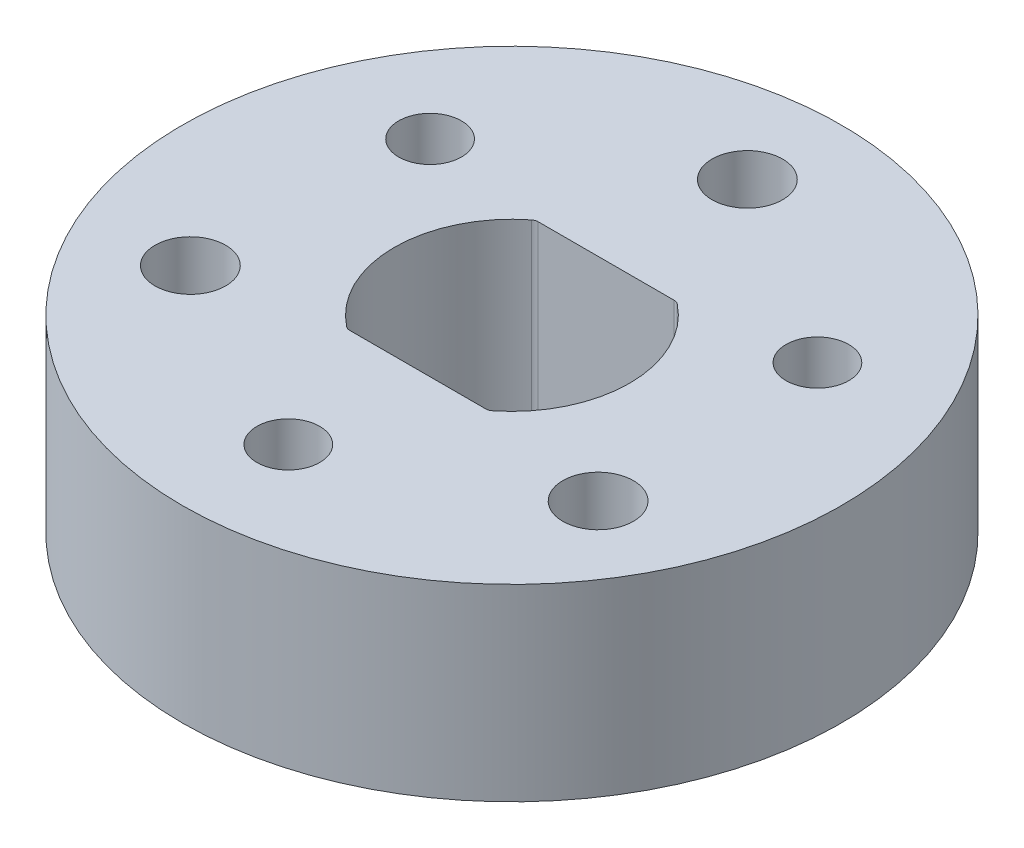
ISO-10303-21;
HEADER;
FILE_DESCRIPTION(('STEP AP214'),'2;1');
FILE_NAME('part.step','',(''),(''),'','','');
FILE_SCHEMA(('AUTOMOTIVE_DESIGN { 1 0 10303 214 1 1 1 1 }'));
ENDSEC;
DATA;
#1=APPLICATION_CONTEXT('core data for automotive mechanical design processes');
#2=APPLICATION_PROTOCOL_DEFINITION('international standard','automotive_design',2000,#1);
#3=PRODUCT_CONTEXT('',#1,'mechanical');
#4=PRODUCT('Part','Part','',(#3));
#5=PRODUCT_RELATED_PRODUCT_CATEGORY('part','',(#4));
#6=PRODUCT_DEFINITION_FORMATION('','',#4);
#7=PRODUCT_DEFINITION_CONTEXT('part definition',#1,'design');
#8=PRODUCT_DEFINITION('design','',#6,#7);
#9=PRODUCT_DEFINITION_SHAPE('','',#8);
#10=(LENGTH_UNIT() NAMED_UNIT(*) SI_UNIT(.MILLI.,.METRE.));
#11=(NAMED_UNIT(*) PLANE_ANGLE_UNIT() SI_UNIT($,.RADIAN.));
#12=(NAMED_UNIT(*) SI_UNIT($,.STERADIAN.) SOLID_ANGLE_UNIT());
#13=UNCERTAINTY_MEASURE_WITH_UNIT(LENGTH_MEASURE(1.E-05),#10,'distance_accuracy_value','');
#14=(GEOMETRIC_REPRESENTATION_CONTEXT(3) GLOBAL_UNCERTAINTY_ASSIGNED_CONTEXT((#13)) GLOBAL_UNIT_ASSIGNED_CONTEXT((#10,
#11,#12)) REPRESENTATION_CONTEXT('',''));
#15=CARTESIAN_POINT('',(0.,0.,0.));
#16=DIRECTION('',(0.,0.,1.));
#17=DIRECTION('',(1.,0.,0.));
#18=AXIS2_PLACEMENT_3D('',#15,#16,#17);
#19=CARTESIAN_POINT('',(0.,12.,0.));
#20=DIRECTION('',(0.,1.,0.));
#21=DIRECTION('',(0.,0.,1.));
#22=AXIS2_PLACEMENT_3D('',#19,#20,#21);
#23=PLANE('',#22);
#24=CARTESIAN_POINT('',(-12.3408620039283,12.,-7.12499999999997));
#25=DIRECTION('',(0.,1.,0.));
#26=DIRECTION('',(0.,0.,1.));
#27=AXIS2_PLACEMENT_3D('',#24,#25,#26);
#28=CIRCLE('',#27,2.);
#29=CARTESIAN_POINT('',(-12.3408620039283,12.,-5.12499999999997));
#30=VERTEX_POINT('',#29);
#31=EDGE_CURVE('E280',#30,#30,#28,.T.);
#32=ORIENTED_EDGE('',*,*,#31,.F.);
#33=EDGE_LOOP('',(#32));
#34=FACE_BOUND('',#33,.T.);
#35=CARTESIAN_POINT('',(12.3408620039282,12.,-7.12500000000108));
#36=DIRECTION('',(0.,1.,0.));
#37=DIRECTION('',(0.,0.,1.));
#38=AXIS2_PLACEMENT_3D('',#35,#36,#37);
#39=CIRCLE('',#38,2.);
#40=CARTESIAN_POINT('',(12.3408620039282,12.,-5.12500000000108));
#41=VERTEX_POINT('',#40);
#42=EDGE_CURVE('E272',#41,#41,#39,.T.);
#43=ORIENTED_EDGE('',*,*,#42,.F.);
#44=EDGE_LOOP('',(#43));
#45=FACE_BOUND('',#44,.T.);
#46=CARTESIAN_POINT('',(9.38288439063618E-13,12.,14.2499999999995));
#47=DIRECTION('',(0.,1.,0.));
#48=DIRECTION('',(0.,0.,1.));
#49=AXIS2_PLACEMENT_3D('',#46,#47,#48);
#50=CIRCLE('',#49,2.);
#51=CARTESIAN_POINT('',(9.38288439063618E-13,12.,16.2499999999995));
#52=VERTEX_POINT('',#51);
#53=EDGE_CURVE('E264',#52,#52,#50,.T.);
#54=ORIENTED_EDGE('',*,*,#53,.F.);
#55=EDGE_LOOP('',(#54));
#56=FACE_BOUND('',#55,.T.);
#57=CARTESIAN_POINT('',(0.,12.,-15.));
#58=DIRECTION('',(0.,1.,0.));
#59=DIRECTION('',(0.,0.,1.));
#60=AXIS2_PLACEMENT_3D('',#57,#58,#59);
#61=CIRCLE('',#60,2.24999999999999);
#62=CARTESIAN_POINT('',(0.,12.,-12.75));
#63=VERTEX_POINT('',#62);
#64=EDGE_CURVE('E256',#63,#63,#61,.T.);
#65=ORIENTED_EDGE('',*,*,#64,.F.);
#66=EDGE_LOOP('',(#65));
#67=FACE_BOUND('',#66,.T.);
#68=CARTESIAN_POINT('',(12.9903810567675,12.,7.49999999999945));
#69=DIRECTION('',(0.,1.,0.));
#70=DIRECTION('',(0.,0.,1.));
#71=AXIS2_PLACEMENT_3D('',#68,#69,#70);
#72=CIRCLE('',#71,2.24999999999999);
#73=CARTESIAN_POINT('',(12.9903810567675,12.,9.74999999999944));
#74=VERTEX_POINT('',#73);
#75=EDGE_CURVE('E248',#74,#74,#72,.T.);
#76=ORIENTED_EDGE('',*,*,#75,.F.);
#77=EDGE_LOOP('',(#76));
#78=FACE_BOUND('',#77,.T.);
#79=CARTESIAN_POINT('',(-12.9903810567656,12.,7.50000000000055));
#80=DIRECTION('',(0.,1.,0.));
#81=DIRECTION('',(0.,0.,1.));
#82=AXIS2_PLACEMENT_3D('',#79,#80,#81);
#83=CIRCLE('',#82,2.24999999999999);
#84=CARTESIAN_POINT('',(-12.9903810567656,12.,9.75000000000054));
#85=VERTEX_POINT('',#84);
#86=EDGE_CURVE('E240',#85,#85,#83,.T.);
#87=ORIENTED_EDGE('',*,*,#86,.F.);
#88=EDGE_LOOP('',(#87));
#89=FACE_BOUND('',#88,.T.);
#90=CARTESIAN_POINT('',(0.,12.,0.));
#91=DIRECTION('',(0.,1.,0.));
#92=DIRECTION('',(0.,0.,1.));
#93=AXIS2_PLACEMENT_3D('',#90,#91,#92);
#94=CIRCLE('',#93,7.50000000000001);
#95=CARTESIAN_POINT('',(4.63942180598808,12.,5.89285714285714));
#96=VERTEX_POINT('',#95);
#97=CARTESIAN_POINT('',(4.63942180598808,12.,-5.89285714285714));
#98=VERTEX_POINT('',#97);
#99=EDGE_CURVE('E142',#96,#98,#94,.T.);
#100=ORIENTED_EDGE('',*,*,#99,.F.);
#101=CARTESIAN_POINT('',(4.33012701892221,12.,5.5));
#102=DIRECTION('',(0.,1.,0.));
#103=DIRECTION('',(0.,0.,1.));
#104=AXIS2_PLACEMENT_3D('',#101,#102,#103);
#105=CIRCLE('',#104,0.5);
#106=CARTESIAN_POINT('',(4.33012701892221,12.,6.));
#107=VERTEX_POINT('',#106);
#108=EDGE_CURVE('E125',#96,#107,#105,.F.);
#109=ORIENTED_EDGE('',*,*,#108,.T.);
#110=DIRECTION('',(1.,0.,0.));
#111=VECTOR('',#110,1.);
#112=CARTESIAN_POINT('',(-4.50000000000002,12.,6.));
#113=LINE('',#112,#111);
#114=CARTESIAN_POINT('',(-4.33012701892221,12.,6.));
#115=VERTEX_POINT('',#114);
#116=EDGE_CURVE('E153',#115,#107,#113,.T.);
#117=ORIENTED_EDGE('',*,*,#116,.F.);
#118=CARTESIAN_POINT('',(-4.33012701892221,12.,5.5));
#119=DIRECTION('',(0.,1.,0.));
#120=DIRECTION('',(0.,0.,1.));
#121=AXIS2_PLACEMENT_3D('',#118,#119,#120);
#122=CIRCLE('',#121,0.5);
#123=CARTESIAN_POINT('',(-4.63942180598808,12.,5.89285714285714));
#124=VERTEX_POINT('',#123);
#125=EDGE_CURVE('E186',#115,#124,#122,.F.);
#126=ORIENTED_EDGE('',*,*,#125,.T.);
#127=CARTESIAN_POINT('',(0.,12.,0.));
#128=DIRECTION('',(0.,1.,0.));
#129=DIRECTION('',(0.,0.,1.));
#130=AXIS2_PLACEMENT_3D('',#127,#128,#129);
#131=CIRCLE('',#130,7.50000000000001);
#132=CARTESIAN_POINT('',(-4.63942180598808,12.,-5.89285714285714));
#133=VERTEX_POINT('',#132);
#134=EDGE_CURVE('E160',#133,#124,#131,.T.);
#135=ORIENTED_EDGE('',*,*,#134,.F.);
#136=CARTESIAN_POINT('',(-4.33012701892221,12.,-5.5));
#137=DIRECTION('',(0.,1.,0.));
#138=DIRECTION('',(0.,0.,1.));
#139=AXIS2_PLACEMENT_3D('',#136,#137,#138);
#140=CIRCLE('',#139,0.5);
#141=CARTESIAN_POINT('',(-4.33012701892221,12.,-6.));
#142=VERTEX_POINT('',#141);
#143=EDGE_CURVE('E192',#133,#142,#140,.F.);
#144=ORIENTED_EDGE('',*,*,#143,.T.);
#145=DIRECTION('',(-1.,0.,0.));
#146=VECTOR('',#145,1.);
#147=CARTESIAN_POINT('',(-4.50000000000002,12.,-6.));
#148=LINE('',#147,#146);
#149=CARTESIAN_POINT('',(4.33012701892221,12.,-6.));
#150=VERTEX_POINT('',#149);
#151=EDGE_CURVE('E206',#150,#142,#148,.T.);
#152=ORIENTED_EDGE('',*,*,#151,.F.);
#153=CARTESIAN_POINT('',(4.33012701892221,12.,-5.5));
#154=DIRECTION('',(0.,1.,0.));
#155=DIRECTION('',(0.,0.,1.));
#156=AXIS2_PLACEMENT_3D('',#153,#154,#155);
#157=CIRCLE('',#156,0.5);
#158=EDGE_CURVE('E68',#150,#98,#157,.F.);
#159=ORIENTED_EDGE('',*,*,#158,.T.);
#160=EDGE_LOOP('',(#100,#109,#117,#126,#135,#144,#152,#159));
#161=FACE_BOUND('',#160,.T.);
#162=CARTESIAN_POINT('',(0.,12.,0.));
#163=DIRECTION('',(0.,1.,0.));
#164=DIRECTION('',(0.,0.,1.));
#165=AXIS2_PLACEMENT_3D('',#162,#163,#164);
#166=CIRCLE('',#165,21.);
#167=CARTESIAN_POINT('',(0.,12.,21.));
#168=VERTEX_POINT('',#167);
#169=EDGE_CURVE('E158',#168,#168,#166,.T.);
#170=ORIENTED_EDGE('',*,*,#169,.T.);
#171=EDGE_LOOP('',(#170));
#172=FACE_BOUND('',#171,.T.);
#173=ADVANCED_FACE('F59',(#34,#45,#56,#67,#78,#89,#161,#172),#23,.T.);
#174=CARTESIAN_POINT('',(0.,0.,0.));
#175=DIRECTION('',(0.,1.,0.));
#176=DIRECTION('',(0.,0.,1.));
#177=AXIS2_PLACEMENT_3D('',#174,#175,#176);
#178=PLANE('',#177);
#179=CARTESIAN_POINT('',(-12.3408620039283,0.,-7.12499999999997));
#180=DIRECTION('',(0.,1.,0.));
#181=DIRECTION('',(0.,0.,1.));
#182=AXIS2_PLACEMENT_3D('',#179,#180,#181);
#183=CIRCLE('',#182,2.);
#184=CARTESIAN_POINT('',(-12.3408620039283,0.,-5.12499999999997));
#185=VERTEX_POINT('',#184);
#186=EDGE_CURVE('E276',#185,#185,#183,.T.);
#187=ORIENTED_EDGE('',*,*,#186,.T.);
#188=EDGE_LOOP('',(#187));
#189=FACE_BOUND('',#188,.T.);
#190=CARTESIAN_POINT('',(12.3408620039282,0.,-7.12500000000108));
#191=DIRECTION('',(0.,1.,0.));
#192=DIRECTION('',(0.,0.,1.));
#193=AXIS2_PLACEMENT_3D('',#190,#191,#192);
#194=CIRCLE('',#193,2.);
#195=CARTESIAN_POINT('',(12.3408620039282,0.,-5.12500000000108));
#196=VERTEX_POINT('',#195);
#197=EDGE_CURVE('E268',#196,#196,#194,.T.);
#198=ORIENTED_EDGE('',*,*,#197,.T.);
#199=EDGE_LOOP('',(#198));
#200=FACE_BOUND('',#199,.T.);
#201=CARTESIAN_POINT('',(9.38288439063618E-13,0.,14.2499999999995));
#202=DIRECTION('',(0.,1.,0.));
#203=DIRECTION('',(0.,0.,1.));
#204=AXIS2_PLACEMENT_3D('',#201,#202,#203);
#205=CIRCLE('',#204,2.);
#206=CARTESIAN_POINT('',(9.38288439063618E-13,0.,16.2499999999995));
#207=VERTEX_POINT('',#206);
#208=EDGE_CURVE('E260',#207,#207,#205,.T.);
#209=ORIENTED_EDGE('',*,*,#208,.T.);
#210=EDGE_LOOP('',(#209));
#211=FACE_BOUND('',#210,.T.);
#212=CARTESIAN_POINT('',(0.,0.,-15.));
#213=DIRECTION('',(0.,1.,0.));
#214=DIRECTION('',(0.,0.,1.));
#215=AXIS2_PLACEMENT_3D('',#212,#213,#214);
#216=CIRCLE('',#215,2.25);
#217=CARTESIAN_POINT('',(0.,0.,-12.75));
#218=VERTEX_POINT('',#217);
#219=EDGE_CURVE('E252',#218,#218,#216,.T.);
#220=ORIENTED_EDGE('',*,*,#219,.T.);
#221=EDGE_LOOP('',(#220));
#222=FACE_BOUND('',#221,.T.);
#223=CARTESIAN_POINT('',(12.9903810567675,0.,7.49999999999945));
#224=DIRECTION('',(0.,1.,0.));
#225=DIRECTION('',(0.,0.,1.));
#226=AXIS2_PLACEMENT_3D('',#223,#224,#225);
#227=CIRCLE('',#226,2.25);
#228=CARTESIAN_POINT('',(12.9903810567675,0.,9.74999999999944));
#229=VERTEX_POINT('',#228);
#230=EDGE_CURVE('E244',#229,#229,#227,.T.);
#231=ORIENTED_EDGE('',*,*,#230,.T.);
#232=EDGE_LOOP('',(#231));
#233=FACE_BOUND('',#232,.T.);
#234=CARTESIAN_POINT('',(-12.9903810567656,0.,7.50000000000055));
#235=DIRECTION('',(0.,1.,0.));
#236=DIRECTION('',(0.,0.,1.));
#237=AXIS2_PLACEMENT_3D('',#234,#235,#236);
#238=CIRCLE('',#237,2.25);
#239=CARTESIAN_POINT('',(-12.9903810567656,0.,9.75000000000055));
#240=VERTEX_POINT('',#239);
#241=EDGE_CURVE('E236',#240,#240,#238,.T.);
#242=ORIENTED_EDGE('',*,*,#241,.T.);
#243=EDGE_LOOP('',(#242));
#244=FACE_BOUND('',#243,.T.);
#245=CARTESIAN_POINT('',(0.,0.,0.));
#246=DIRECTION('',(0.,1.,0.));
#247=DIRECTION('',(0.,0.,1.));
#248=AXIS2_PLACEMENT_3D('',#245,#246,#247);
#249=CIRCLE('',#248,7.50000000000001);
#250=CARTESIAN_POINT('',(-4.63942180598808,0.,-5.89285714285714));
#251=VERTEX_POINT('',#250);
#252=CARTESIAN_POINT('',(-4.63942180598808,0.,5.89285714285714));
#253=VERTEX_POINT('',#252);
#254=EDGE_CURVE('E225',#251,#253,#249,.T.);
#255=ORIENTED_EDGE('',*,*,#254,.T.);
#256=CARTESIAN_POINT('',(-4.33012701892221,0.,5.5));
#257=DIRECTION('',(0.,1.,0.));
#258=DIRECTION('',(0.,0.,1.));
#259=AXIS2_PLACEMENT_3D('',#256,#257,#258);
#260=CIRCLE('',#259,0.5);
#261=CARTESIAN_POINT('',(-4.33012701892221,0.,6.));
#262=VERTEX_POINT('',#261);
#263=EDGE_CURVE('E189',#253,#262,#260,.T.);
#264=ORIENTED_EDGE('',*,*,#263,.T.);
#265=DIRECTION('',(1.,0.,0.));
#266=VECTOR('',#265,1.);
#267=CARTESIAN_POINT('',(-4.50000000000002,0.,6.));
#268=LINE('',#267,#266);
#269=CARTESIAN_POINT('',(4.33012701892221,0.,6.));
#270=VERTEX_POINT('',#269);
#271=EDGE_CURVE('E203',#262,#270,#268,.T.);
#272=ORIENTED_EDGE('',*,*,#271,.T.);
#273=CARTESIAN_POINT('',(4.33012701892221,0.,5.5));
#274=DIRECTION('',(0.,1.,0.));
#275=DIRECTION('',(0.,0.,1.));
#276=AXIS2_PLACEMENT_3D('',#273,#274,#275);
#277=CIRCLE('',#276,0.5);
#278=CARTESIAN_POINT('',(4.63942180598808,0.,5.89285714285714));
#279=VERTEX_POINT('',#278);
#280=EDGE_CURVE('E136',#270,#279,#277,.T.);
#281=ORIENTED_EDGE('',*,*,#280,.T.);
#282=CARTESIAN_POINT('',(0.,0.,0.));
#283=DIRECTION('',(0.,1.,0.));
#284=DIRECTION('',(0.,0.,1.));
#285=AXIS2_PLACEMENT_3D('',#282,#283,#284);
#286=CIRCLE('',#285,7.50000000000001);
#287=CARTESIAN_POINT('',(4.63942180598808,0.,-5.89285714285714));
#288=VERTEX_POINT('',#287);
#289=EDGE_CURVE('E144',#279,#288,#286,.T.);
#290=ORIENTED_EDGE('',*,*,#289,.T.);
#291=CARTESIAN_POINT('',(4.33012701892221,0.,-5.5));
#292=DIRECTION('',(0.,1.,0.));
#293=DIRECTION('',(0.,0.,1.));
#294=AXIS2_PLACEMENT_3D('',#291,#292,#293);
#295=CIRCLE('',#294,0.5);
#296=CARTESIAN_POINT('',(4.33012701892221,0.,-6.));
#297=VERTEX_POINT('',#296);
#298=EDGE_CURVE('E13',#288,#297,#295,.T.);
#299=ORIENTED_EDGE('',*,*,#298,.T.);
#300=DIRECTION('',(-1.,0.,0.));
#301=VECTOR('',#300,1.);
#302=CARTESIAN_POINT('',(-4.50000000000002,0.,-6.));
#303=LINE('',#302,#301);
#304=CARTESIAN_POINT('',(-4.33012701892221,0.,-6.));
#305=VERTEX_POINT('',#304);
#306=EDGE_CURVE('E230',#297,#305,#303,.T.);
#307=ORIENTED_EDGE('',*,*,#306,.T.);
#308=CARTESIAN_POINT('',(-4.33012701892221,0.,-5.5));
#309=DIRECTION('',(0.,1.,0.));
#310=DIRECTION('',(0.,0.,1.));
#311=AXIS2_PLACEMENT_3D('',#308,#309,#310);
#312=CIRCLE('',#311,0.5);
#313=EDGE_CURVE('E195',#305,#251,#312,.T.);
#314=ORIENTED_EDGE('',*,*,#313,.T.);
#315=EDGE_LOOP('',(#255,#264,#272,#281,#290,#299,#307,#314));
#316=FACE_BOUND('',#315,.T.);
#317=CARTESIAN_POINT('',(0.,0.,0.));
#318=DIRECTION('',(0.,1.,0.));
#319=DIRECTION('',(0.,0.,1.));
#320=AXIS2_PLACEMENT_3D('',#317,#318,#319);
#321=CIRCLE('',#320,21.);
#322=CARTESIAN_POINT('',(0.,0.,21.));
#323=VERTEX_POINT('',#322);
#324=EDGE_CURVE('E152',#323,#323,#321,.T.);
#325=ORIENTED_EDGE('',*,*,#324,.F.);
#326=EDGE_LOOP('',(#325));
#327=FACE_BOUND('',#326,.T.);
#328=ADVANCED_FACE('F223',(#189,#200,#211,#222,#233,#244,#316,#327),#178,.F.);
#329=CARTESIAN_POINT('',(0.,12.,0.));
#330=DIRECTION('',(0.,-1.,0.));
#331=DIRECTION('',(0.,0.,-1.));
#332=AXIS2_PLACEMENT_3D('',#329,#330,#331);
#333=CYLINDRICAL_SURFACE('',#332,21.);
#334=ORIENTED_EDGE('',*,*,#169,.F.);
#335=EDGE_LOOP('',(#334));
#336=FACE_BOUND('',#335,.T.);
#337=ORIENTED_EDGE('',*,*,#324,.T.);
#338=EDGE_LOOP('',(#337));
#339=FACE_BOUND('',#338,.T.);
#340=ADVANCED_FACE('F325',(#336,#339),#333,.T.);
#341=CARTESIAN_POINT('',(0.,0.,0.));
#342=DIRECTION('',(0.,1.,0.));
#343=DIRECTION('',(0.,0.,1.));
#344=AXIS2_PLACEMENT_3D('',#341,#342,#343);
#345=CYLINDRICAL_SURFACE('',#344,7.50000000000001);
#346=ORIENTED_EDGE('',*,*,#289,.F.);
#347=DIRECTION('',(0.,1.,0.));
#348=VECTOR('',#347,1.);
#349=CARTESIAN_POINT('',(4.63942180598808,0.,5.89285714285714));
#350=LINE('',#349,#348);
#351=EDGE_CURVE('E129',#279,#96,#350,.T.);
#352=ORIENTED_EDGE('',*,*,#351,.T.);
#353=ORIENTED_EDGE('',*,*,#99,.T.);
#354=DIRECTION('',(0.,1.,0.));
#355=VECTOR('',#354,1.);
#356=CARTESIAN_POINT('',(4.63942180598808,0.,-5.89285714285714));
#357=LINE('',#356,#355);
#358=EDGE_CURVE('E147',#98,#288,#357,.F.);
#359=ORIENTED_EDGE('',*,*,#358,.T.);
#360=EDGE_LOOP('',(#346,#352,#353,#359));
#361=FACE_BOUND('',#360,.T.);
#362=ADVANCED_FACE('F141',(#361),#345,.F.);
#363=CARTESIAN_POINT('',(-4.50000000000002,0.,6.));
#364=DIRECTION('',(0.,0.,1.));
#365=DIRECTION('',(1.,0.,0.));
#366=AXIS2_PLACEMENT_3D('',#363,#364,#365);
#367=PLANE('',#366);
#368=ORIENTED_EDGE('',*,*,#116,.T.);
#369=DIRECTION('',(0.,-1.,0.));
#370=VECTOR('',#369,1.);
#371=CARTESIAN_POINT('',(4.33012701892221,0.,6.));
#372=LINE('',#371,#370);
#373=EDGE_CURVE('E130',#107,#270,#372,.T.);
#374=ORIENTED_EDGE('',*,*,#373,.T.);
#375=ORIENTED_EDGE('',*,*,#271,.F.);
#376=DIRECTION('',(0.,-1.,0.));
#377=VECTOR('',#376,1.);
#378=CARTESIAN_POINT('',(-4.33012701892221,12.,6.));
#379=LINE('',#378,#377);
#380=EDGE_CURVE('E146',#262,#115,#379,.F.);
#381=ORIENTED_EDGE('',*,*,#380,.T.);
#382=EDGE_LOOP('',(#368,#374,#375,#381));
#383=FACE_BOUND('',#382,.T.);
#384=ADVANCED_FACE('F227',(#383),#367,.F.);
#385=CARTESIAN_POINT('',(0.,0.,0.));
#386=DIRECTION('',(0.,1.,0.));
#387=DIRECTION('',(0.,0.,1.));
#388=AXIS2_PLACEMENT_3D('',#385,#386,#387);
#389=CYLINDRICAL_SURFACE('',#388,7.50000000000001);
#390=ORIENTED_EDGE('',*,*,#134,.T.);
#391=DIRECTION('',(0.,1.,0.));
#392=VECTOR('',#391,1.);
#393=CARTESIAN_POINT('',(-4.63942180598808,0.,5.89285714285714));
#394=LINE('',#393,#392);
#395=EDGE_CURVE('E175',#124,#253,#394,.F.);
#396=ORIENTED_EDGE('',*,*,#395,.T.);
#397=ORIENTED_EDGE('',*,*,#254,.F.);
#398=DIRECTION('',(0.,1.,0.));
#399=VECTOR('',#398,1.);
#400=CARTESIAN_POINT('',(-4.63942180598808,0.,-5.89285714285714));
#401=LINE('',#400,#399);
#402=EDGE_CURVE('E171',#251,#133,#401,.T.);
#403=ORIENTED_EDGE('',*,*,#402,.T.);
#404=EDGE_LOOP('',(#390,#396,#397,#403));
#405=FACE_BOUND('',#404,.T.);
#406=ADVANCED_FACE('F213',(#405),#389,.F.);
#407=CARTESIAN_POINT('',(-4.50000000000002,0.,-6.));
#408=DIRECTION('',(0.,0.,-1.));
#409=DIRECTION('',(-1.,0.,0.));
#410=AXIS2_PLACEMENT_3D('',#407,#408,#409);
#411=PLANE('',#410);
#412=ORIENTED_EDGE('',*,*,#151,.T.);
#413=DIRECTION('',(0.,-1.,0.));
#414=VECTOR('',#413,1.);
#415=CARTESIAN_POINT('',(-4.33012701892221,0.,-6.));
#416=LINE('',#415,#414);
#417=EDGE_CURVE('E75',#142,#305,#416,.T.);
#418=ORIENTED_EDGE('',*,*,#417,.T.);
#419=ORIENTED_EDGE('',*,*,#306,.F.);
#420=DIRECTION('',(0.,-1.,0.));
#421=VECTOR('',#420,1.);
#422=CARTESIAN_POINT('',(4.33012701892221,12.,-6.));
#423=LINE('',#422,#421);
#424=EDGE_CURVE('E178',#297,#150,#423,.F.);
#425=ORIENTED_EDGE('',*,*,#424,.T.);
#426=EDGE_LOOP('',(#412,#418,#419,#425));
#427=FACE_BOUND('',#426,.T.);
#428=ADVANCED_FACE('F321',(#427),#411,.F.);
#429=CARTESIAN_POINT('',(4.33012701892221,0.,5.5));
#430=DIRECTION('',(0.,1.,0.));
#431=DIRECTION('',(0.,0.,1.));
#432=AXIS2_PLACEMENT_3D('',#429,#430,#431);
#433=CYLINDRICAL_SURFACE('',#432,0.5);
#434=ORIENTED_EDGE('',*,*,#280,.F.);
#435=ORIENTED_EDGE('',*,*,#373,.F.);
#436=ORIENTED_EDGE('',*,*,#108,.F.);
#437=ORIENTED_EDGE('',*,*,#351,.F.);
#438=EDGE_LOOP('',(#434,#435,#436,#437));
#439=FACE_BOUND('',#438,.T.);
#440=ADVANCED_FACE('F128',(#439),#433,.F.);
#441=CARTESIAN_POINT('',(-4.33012701892221,0.,5.5));
#442=DIRECTION('',(0.,1.,0.));
#443=DIRECTION('',(0.,0.,1.));
#444=AXIS2_PLACEMENT_3D('',#441,#442,#443);
#445=CYLINDRICAL_SURFACE('',#444,0.5);
#446=ORIENTED_EDGE('',*,*,#263,.F.);
#447=ORIENTED_EDGE('',*,*,#395,.F.);
#448=ORIENTED_EDGE('',*,*,#125,.F.);
#449=ORIENTED_EDGE('',*,*,#380,.F.);
#450=EDGE_LOOP('',(#446,#447,#448,#449));
#451=FACE_BOUND('',#450,.T.);
#452=ADVANCED_FACE('F219',(#451),#445,.F.);
#453=CARTESIAN_POINT('',(-4.33012701892221,0.,-5.5));
#454=DIRECTION('',(0.,1.,0.));
#455=DIRECTION('',(0.,0.,1.));
#456=AXIS2_PLACEMENT_3D('',#453,#454,#455);
#457=CYLINDRICAL_SURFACE('',#456,0.5);
#458=ORIENTED_EDGE('',*,*,#313,.F.);
#459=ORIENTED_EDGE('',*,*,#417,.F.);
#460=ORIENTED_EDGE('',*,*,#143,.F.);
#461=ORIENTED_EDGE('',*,*,#402,.F.);
#462=EDGE_LOOP('',(#458,#459,#460,#461));
#463=FACE_BOUND('',#462,.T.);
#464=ADVANCED_FACE('F312',(#463),#457,.F.);
#465=CARTESIAN_POINT('',(4.33012701892221,0.,-5.5));
#466=DIRECTION('',(0.,1.,0.));
#467=DIRECTION('',(0.,0.,1.));
#468=AXIS2_PLACEMENT_3D('',#465,#466,#467);
#469=CYLINDRICAL_SURFACE('',#468,0.5);
#470=ORIENTED_EDGE('',*,*,#298,.F.);
#471=ORIENTED_EDGE('',*,*,#358,.F.);
#472=ORIENTED_EDGE('',*,*,#158,.F.);
#473=ORIENTED_EDGE('',*,*,#424,.F.);
#474=EDGE_LOOP('',(#470,#471,#472,#473));
#475=FACE_BOUND('',#474,.T.);
#476=ADVANCED_FACE('F61',(#475),#469,.F.);
#477=CARTESIAN_POINT('',(-12.9903810567656,12.,7.50000000000055));
#478=DIRECTION('',(0.,1.,0.));
#479=DIRECTION('',(0.,0.,1.));
#480=AXIS2_PLACEMENT_3D('',#477,#478,#479);
#481=CYLINDRICAL_SURFACE('',#480,2.24999999999999);
#482=ORIENTED_EDGE('',*,*,#241,.F.);
#483=EDGE_LOOP('',(#482));
#484=FACE_BOUND('',#483,.T.);
#485=ORIENTED_EDGE('',*,*,#86,.T.);
#486=EDGE_LOOP('',(#485));
#487=FACE_BOUND('',#486,.T.);
#488=ADVANCED_FACE('F300',(#484,#487),#481,.F.);
#489=CARTESIAN_POINT('',(12.9903810567675,12.,7.49999999999945));
#490=DIRECTION('',(0.,1.,0.));
#491=DIRECTION('',(0.,0.,1.));
#492=AXIS2_PLACEMENT_3D('',#489,#490,#491);
#493=CYLINDRICAL_SURFACE('',#492,2.24999999999999);
#494=ORIENTED_EDGE('',*,*,#230,.F.);
#495=EDGE_LOOP('',(#494));
#496=FACE_BOUND('',#495,.T.);
#497=ORIENTED_EDGE('',*,*,#75,.T.);
#498=EDGE_LOOP('',(#497));
#499=FACE_BOUND('',#498,.T.);
#500=ADVANCED_FACE('F302',(#496,#499),#493,.F.);
#501=CARTESIAN_POINT('',(0.,12.,-15.));
#502=DIRECTION('',(0.,1.,0.));
#503=DIRECTION('',(0.,0.,1.));
#504=AXIS2_PLACEMENT_3D('',#501,#502,#503);
#505=CYLINDRICAL_SURFACE('',#504,2.24999999999999);
#506=ORIENTED_EDGE('',*,*,#219,.F.);
#507=EDGE_LOOP('',(#506));
#508=FACE_BOUND('',#507,.T.);
#509=ORIENTED_EDGE('',*,*,#64,.T.);
#510=EDGE_LOOP('',(#509));
#511=FACE_BOUND('',#510,.T.);
#512=ADVANCED_FACE('F309',(#508,#511),#505,.F.);
#513=CARTESIAN_POINT('',(9.38288439063618E-13,12.,14.2499999999995));
#514=DIRECTION('',(0.,1.,0.));
#515=DIRECTION('',(0.,0.,1.));
#516=AXIS2_PLACEMENT_3D('',#513,#514,#515);
#517=CYLINDRICAL_SURFACE('',#516,2.);
#518=ORIENTED_EDGE('',*,*,#208,.F.);
#519=EDGE_LOOP('',(#518));
#520=FACE_BOUND('',#519,.T.);
#521=ORIENTED_EDGE('',*,*,#53,.T.);
#522=EDGE_LOOP('',(#521));
#523=FACE_BOUND('',#522,.T.);
#524=ADVANCED_FACE('F369',(#520,#523),#517,.F.);
#525=CARTESIAN_POINT('',(12.3408620039282,12.,-7.12500000000108));
#526=DIRECTION('',(0.,1.,0.));
#527=DIRECTION('',(0.,0.,1.));
#528=AXIS2_PLACEMENT_3D('',#525,#526,#527);
#529=CYLINDRICAL_SURFACE('',#528,2.);
#530=ORIENTED_EDGE('',*,*,#197,.F.);
#531=EDGE_LOOP('',(#530));
#532=FACE_BOUND('',#531,.T.);
#533=ORIENTED_EDGE('',*,*,#42,.T.);
#534=EDGE_LOOP('',(#533));
#535=FACE_BOUND('',#534,.T.);
#536=ADVANCED_FACE('F378',(#532,#535),#529,.F.);
#537=CARTESIAN_POINT('',(-12.3408620039283,12.,-7.12499999999997));
#538=DIRECTION('',(0.,1.,0.));
#539=DIRECTION('',(0.,0.,1.));
#540=AXIS2_PLACEMENT_3D('',#537,#538,#539);
#541=CYLINDRICAL_SURFACE('',#540,2.);
#542=ORIENTED_EDGE('',*,*,#186,.F.);
#543=EDGE_LOOP('',(#542));
#544=FACE_BOUND('',#543,.T.);
#545=ORIENTED_EDGE('',*,*,#31,.T.);
#546=EDGE_LOOP('',(#545));
#547=FACE_BOUND('',#546,.T.);
#548=ADVANCED_FACE('F285',(#544,#547),#541,.F.);
#549=CLOSED_SHELL('',(#173,#328,#340,#362,#384,#406,#428,#440,#452,#464,#476,#488,#500,#512,
#524,#536,#548));
#550=MANIFOLD_SOLID_BREP('B2',#549);
#551=ADVANCED_BREP_SHAPE_REPRESENTATION('',(#18,#550),#14);
#552=SHAPE_DEFINITION_REPRESENTATION(#9,#551);
ENDSEC;
END-ISO-10303-21;
